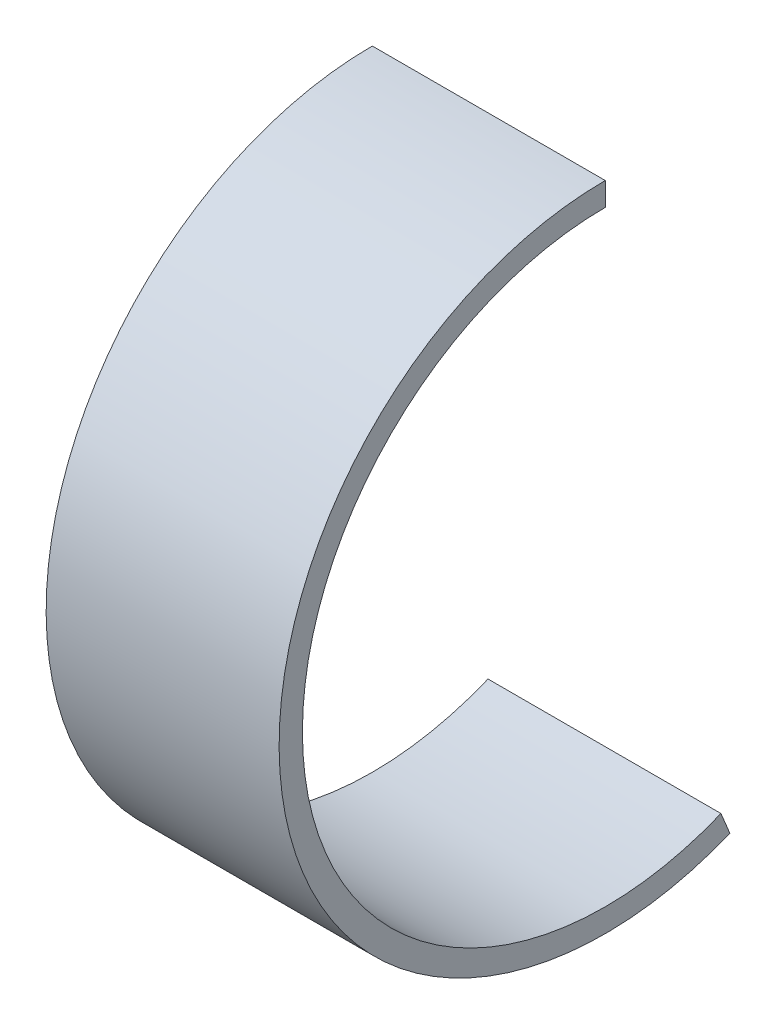
ISO-10303-21;
HEADER;
FILE_DESCRIPTION(('STEP AP214'),'2;1');
FILE_NAME('part.step','',(''),(''),'','','');
FILE_SCHEMA(('AUTOMOTIVE_DESIGN { 1 0 10303 214 1 1 1 1 }'));
ENDSEC;
DATA;
#1=APPLICATION_CONTEXT('core data for automotive mechanical design processes');
#2=APPLICATION_PROTOCOL_DEFINITION('international standard','automotive_design',2000,#1);
#3=PRODUCT_CONTEXT('',#1,'mechanical');
#4=PRODUCT('Part','Part','',(#3));
#5=PRODUCT_RELATED_PRODUCT_CATEGORY('part','',(#4));
#6=PRODUCT_DEFINITION_FORMATION('','',#4);
#7=PRODUCT_DEFINITION_CONTEXT('part definition',#1,'design');
#8=PRODUCT_DEFINITION('design','',#6,#7);
#9=PRODUCT_DEFINITION_SHAPE('','',#8);
#10=(LENGTH_UNIT() NAMED_UNIT(*) SI_UNIT(.MILLI.,.METRE.));
#11=(NAMED_UNIT(*) PLANE_ANGLE_UNIT() SI_UNIT($,.RADIAN.));
#12=(NAMED_UNIT(*) SI_UNIT($,.STERADIAN.) SOLID_ANGLE_UNIT());
#13=UNCERTAINTY_MEASURE_WITH_UNIT(LENGTH_MEASURE(1.E-05),#10,'distance_accuracy_value','');
#14=(GEOMETRIC_REPRESENTATION_CONTEXT(3) GLOBAL_UNCERTAINTY_ASSIGNED_CONTEXT((#13)) GLOBAL_UNIT_ASSIGNED_CONTEXT((#10,
#11,#12)) REPRESENTATION_CONTEXT('',''));
#15=CARTESIAN_POINT('',(0.,0.,0.));
#16=DIRECTION('',(0.,0.,1.));
#17=DIRECTION('',(1.,0.,0.));
#18=AXIS2_PLACEMENT_3D('',#15,#16,#17);
#19=CARTESIAN_POINT('',(508.,0.,0.));
#20=DIRECTION('',(-1.,0.,0.));
#21=DIRECTION('',(0.,0.,1.));
#22=AXIS2_PLACEMENT_3D('',#19,#20,#21);
#23=CYLINDRICAL_SURFACE('',#22,711.2);
#24=CARTESIAN_POINT('',(0.,0.,0.));
#25=DIRECTION('',(1.,0.,0.));
#26=DIRECTION('',(0.,0.,-1.));
#27=AXIS2_PLACEMENT_3D('',#24,#25,#26);
#28=CIRCLE('',#27,711.2);
#29=CARTESIAN_POINT('',(0.,711.2,0.));
#30=VERTEX_POINT('',#29);
#31=CARTESIAN_POINT('',(0.,-657.26102598502,-271.686186106542));
#32=VERTEX_POINT('',#31);
#33=EDGE_CURVE('E96',#30,#32,#28,.T.);
#34=ORIENTED_EDGE('',*,*,#33,.T.);
#35=DIRECTION('',(-1.,0.,0.));
#36=VECTOR('',#35,1.);
#37=CARTESIAN_POINT('',(508.,-657.26102598502,-271.686186106542));
#38=LINE('',#37,#36);
#39=CARTESIAN_POINT('',(508.,-657.26102598502,-271.686186106542));
#40=VERTEX_POINT('',#39);
#41=EDGE_CURVE('E11',#40,#32,#38,.T.);
#42=ORIENTED_EDGE('',*,*,#41,.F.);
#43=CARTESIAN_POINT('',(508.,0.,0.));
#44=DIRECTION('',(1.,0.,0.));
#45=DIRECTION('',(0.,0.,-1.));
#46=AXIS2_PLACEMENT_3D('',#43,#44,#45);
#47=CIRCLE('',#46,711.2);
#48=CARTESIAN_POINT('',(508.,711.2,0.));
#49=VERTEX_POINT('',#48);
#50=EDGE_CURVE('E73',#49,#40,#47,.T.);
#51=ORIENTED_EDGE('',*,*,#50,.F.);
#52=DIRECTION('',(-1.,0.,0.));
#53=VECTOR('',#52,1.);
#54=CARTESIAN_POINT('',(508.,711.2,0.));
#55=LINE('',#54,#53);
#56=EDGE_CURVE('E49',#49,#30,#55,.T.);
#57=ORIENTED_EDGE('',*,*,#56,.T.);
#58=EDGE_LOOP('',(#34,#42,#51,#57));
#59=FACE_BOUND('',#58,.T.);
#60=ADVANCED_FACE('F33',(#59),#23,.T.);
#61=CARTESIAN_POINT('',(508.,-610.313809843233,-252.280029956075));
#62=DIRECTION('',(0.,0.382010947843845,-0.924157798066676));
#63=DIRECTION('',(0.,0.924157798066676,0.382010947843845));
#64=AXIS2_PLACEMENT_3D('',#61,#62,#63);
#65=PLANE('',#64);
#66=DIRECTION('',(0.,-0.924157798066676,-0.382010947843845));
#67=VECTOR('',#66,1.);
#68=CARTESIAN_POINT('',(0.,-610.313809843233,-252.280029956075));
#69=LINE('',#68,#67);
#70=CARTESIAN_POINT('',(0.,-610.313809843233,-252.280029956075));
#71=VERTEX_POINT('',#70);
#72=EDGE_CURVE('E82',#71,#32,#69,.T.);
#73=ORIENTED_EDGE('',*,*,#72,.F.);
#74=DIRECTION('',(-1.,0.,0.));
#75=VECTOR('',#74,1.);
#76=CARTESIAN_POINT('',(508.,-610.313809843233,-252.280029956075));
#77=LINE('',#76,#75);
#78=CARTESIAN_POINT('',(508.,-610.313809843233,-252.280029956075));
#79=VERTEX_POINT('',#78);
#80=EDGE_CURVE('E41',#79,#71,#77,.T.);
#81=ORIENTED_EDGE('',*,*,#80,.F.);
#82=DIRECTION('',(0.,-0.924157798066676,-0.382010947843845));
#83=VECTOR('',#82,1.);
#84=CARTESIAN_POINT('',(508.,-610.313809843233,-252.280029956075));
#85=LINE('',#84,#83);
#86=EDGE_CURVE('E80',#79,#40,#85,.T.);
#87=ORIENTED_EDGE('',*,*,#86,.T.);
#88=ORIENTED_EDGE('',*,*,#41,.T.);
#89=EDGE_LOOP('',(#73,#81,#87,#88));
#90=FACE_BOUND('',#89,.T.);
#91=ADVANCED_FACE('F79',(#90),#65,.T.);
#92=CARTESIAN_POINT('',(508.,0.,0.));
#93=DIRECTION('',(-1.,0.,0.));
#94=DIRECTION('',(0.,0.,1.));
#95=AXIS2_PLACEMENT_3D('',#92,#93,#94);
#96=CYLINDRICAL_SURFACE('',#95,660.4);
#97=CARTESIAN_POINT('',(0.,0.,0.));
#98=DIRECTION('',(1.,0.,0.));
#99=DIRECTION('',(0.,0.,-1.));
#100=AXIS2_PLACEMENT_3D('',#97,#98,#99);
#101=CIRCLE('',#100,660.4);
#102=CARTESIAN_POINT('',(0.,660.4,0.));
#103=VERTEX_POINT('',#102);
#104=EDGE_CURVE('E99',#103,#71,#101,.T.);
#105=ORIENTED_EDGE('',*,*,#104,.F.);
#106=DIRECTION('',(-1.,0.,0.));
#107=VECTOR('',#106,1.);
#108=CARTESIAN_POINT('',(508.,660.4,0.));
#109=LINE('',#108,#107);
#110=CARTESIAN_POINT('',(508.,660.4,0.));
#111=VERTEX_POINT('',#110);
#112=EDGE_CURVE('E62',#111,#103,#109,.T.);
#113=ORIENTED_EDGE('',*,*,#112,.F.);
#114=CARTESIAN_POINT('',(508.,0.,0.));
#115=DIRECTION('',(1.,0.,0.));
#116=DIRECTION('',(0.,0.,-1.));
#117=AXIS2_PLACEMENT_3D('',#114,#115,#116);
#118=CIRCLE('',#117,660.4);
#119=EDGE_CURVE('E88',#111,#79,#118,.T.);
#120=ORIENTED_EDGE('',*,*,#119,.T.);
#121=ORIENTED_EDGE('',*,*,#80,.T.);
#122=EDGE_LOOP('',(#105,#113,#120,#121));
#123=FACE_BOUND('',#122,.T.);
#124=ADVANCED_FACE('F90',(#123),#96,.F.);
#125=CARTESIAN_POINT('',(508.,711.2,0.));
#126=DIRECTION('',(0.,0.,-1.));
#127=DIRECTION('',(0.,1.,0.));
#128=AXIS2_PLACEMENT_3D('',#125,#126,#127);
#129=PLANE('',#128);
#130=DIRECTION('',(0.,-1.,0.));
#131=VECTOR('',#130,1.);
#132=CARTESIAN_POINT('',(0.,711.2,0.));
#133=LINE('',#132,#131);
#134=EDGE_CURVE('E101',#30,#103,#133,.T.);
#135=ORIENTED_EDGE('',*,*,#134,.F.);
#136=ORIENTED_EDGE('',*,*,#56,.F.);
#137=DIRECTION('',(0.,-1.,0.));
#138=VECTOR('',#137,1.);
#139=CARTESIAN_POINT('',(508.,711.2,0.));
#140=LINE('',#139,#138);
#141=EDGE_CURVE('E91',#49,#111,#140,.T.);
#142=ORIENTED_EDGE('',*,*,#141,.T.);
#143=ORIENTED_EDGE('',*,*,#112,.T.);
#144=EDGE_LOOP('',(#135,#136,#142,#143));
#145=FACE_BOUND('',#144,.T.);
#146=ADVANCED_FACE('F107',(#145),#129,.T.);
#147=CARTESIAN_POINT('',(508.,0.,0.));
#148=DIRECTION('',(1.,0.,0.));
#149=DIRECTION('',(0.,0.,-1.));
#150=AXIS2_PLACEMENT_3D('',#147,#148,#149);
#151=PLANE('',#150);
#152=ORIENTED_EDGE('',*,*,#50,.T.);
#153=ORIENTED_EDGE('',*,*,#86,.F.);
#154=ORIENTED_EDGE('',*,*,#119,.F.);
#155=ORIENTED_EDGE('',*,*,#141,.F.);
#156=EDGE_LOOP('',(#152,#153,#154,#155));
#157=FACE_BOUND('',#156,.T.);
#158=ADVANCED_FACE('F87',(#157),#151,.T.);
#159=CARTESIAN_POINT('',(0.,0.,0.));
#160=DIRECTION('',(1.,0.,0.));
#161=DIRECTION('',(0.,0.,-1.));
#162=AXIS2_PLACEMENT_3D('',#159,#160,#161);
#163=PLANE('',#162);
#164=ORIENTED_EDGE('',*,*,#33,.F.);
#165=ORIENTED_EDGE('',*,*,#134,.T.);
#166=ORIENTED_EDGE('',*,*,#104,.T.);
#167=ORIENTED_EDGE('',*,*,#72,.T.);
#168=EDGE_LOOP('',(#164,#165,#166,#167));
#169=FACE_BOUND('',#168,.T.);
#170=ADVANCED_FACE('F106',(#169),#163,.F.);
#171=CLOSED_SHELL('',(#60,#91,#124,#146,#158,#170));
#172=MANIFOLD_SOLID_BREP('B2',#171);
#173=ADVANCED_BREP_SHAPE_REPRESENTATION('',(#18,#172),#14);
#174=SHAPE_DEFINITION_REPRESENTATION(#9,#173);
ENDSEC;
END-ISO-10303-21;
